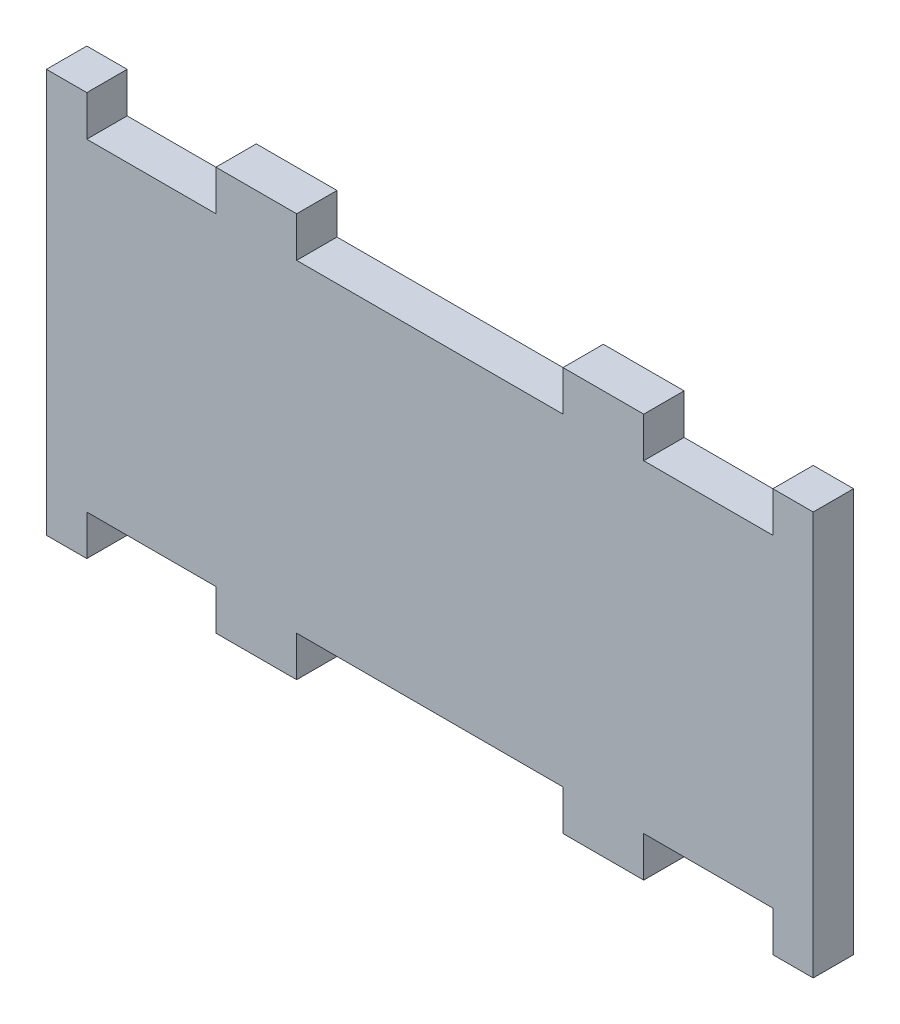
ISO-10303-21;
HEADER;
FILE_DESCRIPTION(('STEP AP214'),'2;1');
FILE_NAME('part.step','',(''),(''),'','','');
FILE_SCHEMA(('AUTOMOTIVE_DESIGN { 1 0 10303 214 1 1 1 1 }'));
ENDSEC;
DATA;
#1=APPLICATION_CONTEXT('core data for automotive mechanical design processes');
#2=APPLICATION_PROTOCOL_DEFINITION('international standard','automotive_design',2000,#1);
#3=PRODUCT_CONTEXT('',#1,'mechanical');
#4=PRODUCT('Part','Part','',(#3));
#5=PRODUCT_RELATED_PRODUCT_CATEGORY('part','',(#4));
#6=PRODUCT_DEFINITION_FORMATION('','',#4);
#7=PRODUCT_DEFINITION_CONTEXT('part definition',#1,'design');
#8=PRODUCT_DEFINITION('design','',#6,#7);
#9=PRODUCT_DEFINITION_SHAPE('','',#8);
#10=(LENGTH_UNIT() NAMED_UNIT(*) SI_UNIT(.MILLI.,.METRE.));
#11=(NAMED_UNIT(*) PLANE_ANGLE_UNIT() SI_UNIT($,.RADIAN.));
#12=(NAMED_UNIT(*) SI_UNIT($,.STERADIAN.) SOLID_ANGLE_UNIT());
#13=UNCERTAINTY_MEASURE_WITH_UNIT(LENGTH_MEASURE(1.E-05),#10,'distance_accuracy_value','');
#14=(GEOMETRIC_REPRESENTATION_CONTEXT(3) GLOBAL_UNCERTAINTY_ASSIGNED_CONTEXT((#13)) GLOBAL_UNIT_ASSIGNED_CONTEXT((#10,
#11,#12)) REPRESENTATION_CONTEXT('',''));
#15=CARTESIAN_POINT('',(0.,0.,0.));
#16=DIRECTION('',(0.,0.,1.));
#17=DIRECTION('',(1.,0.,0.));
#18=AXIS2_PLACEMENT_3D('',#15,#16,#17);
#19=CARTESIAN_POINT('',(0.,0.,6.35));
#20=DIRECTION('',(0.,1.,0.));
#21=DIRECTION('',(0.,0.,1.));
#22=AXIS2_PLACEMENT_3D('',#19,#20,#21);
#23=PLANE('',#22);
#24=DIRECTION('',(1.,0.,0.));
#25=VECTOR('',#24,1.);
#26=CARTESIAN_POINT('',(0.,0.,0.));
#27=LINE('',#26,#25);
#28=CARTESIAN_POINT('',(0.,0.,0.));
#29=VERTEX_POINT('',#28);
#30=CARTESIAN_POINT('',(6.34999999999999,0.,0.));
#31=VERTEX_POINT('',#30);
#32=EDGE_CURVE('E283',#29,#31,#27,.T.);
#33=ORIENTED_EDGE('',*,*,#32,.T.);
#34=DIRECTION('',(0.,0.,1.));
#35=VECTOR('',#34,1.);
#36=CARTESIAN_POINT('',(6.35,0.,-0.00100000000000013));
#37=LINE('',#36,#35);
#38=CARTESIAN_POINT('',(6.35,0.,6.35));
#39=VERTEX_POINT('',#38);
#40=EDGE_CURVE('E313',#31,#39,#37,.T.);
#41=ORIENTED_EDGE('',*,*,#40,.T.);
#42=DIRECTION('',(1.,0.,0.));
#43=VECTOR('',#42,1.);
#44=CARTESIAN_POINT('',(0.,0.,6.35));
#45=LINE('',#44,#43);
#46=CARTESIAN_POINT('',(0.,0.,6.35));
#47=VERTEX_POINT('',#46);
#48=EDGE_CURVE('E267',#47,#39,#45,.T.);
#49=ORIENTED_EDGE('',*,*,#48,.F.);
#50=DIRECTION('',(0.,0.,-1.));
#51=VECTOR('',#50,1.);
#52=CARTESIAN_POINT('',(0.,0.,6.35));
#53=LINE('',#52,#51);
#54=EDGE_CURVE('E11',#47,#29,#53,.T.);
#55=ORIENTED_EDGE('',*,*,#54,.T.);
#56=EDGE_LOOP('',(#33,#41,#49,#55));
#57=FACE_BOUND('',#56,.T.);
#58=ADVANCED_FACE('F39',(#57),#23,.F.);
#59=CARTESIAN_POINT('',(26.67,0.,6.35));
#60=VERTEX_POINT('',#59);
#61=CARTESIAN_POINT('',(39.37,0.,6.35));
#62=VERTEX_POINT('',#61);
#63=EDGE_CURVE('E269',#60,#62,#45,.T.);
#64=ORIENTED_EDGE('',*,*,#63,.F.);
#65=DIRECTION('',(0.,0.,1.));
#66=VECTOR('',#65,1.);
#67=CARTESIAN_POINT('',(26.67,0.,-0.00100000000000013));
#68=LINE('',#67,#66);
#69=CARTESIAN_POINT('',(26.67,0.,0.));
#70=VERTEX_POINT('',#69);
#71=EDGE_CURVE('E427',#70,#60,#68,.T.);
#72=ORIENTED_EDGE('',*,*,#71,.F.);
#73=CARTESIAN_POINT('',(39.37,0.,0.));
#74=VERTEX_POINT('',#73);
#75=EDGE_CURVE('E285',#70,#74,#27,.T.);
#76=ORIENTED_EDGE('',*,*,#75,.T.);
#77=DIRECTION('',(0.,0.,1.));
#78=VECTOR('',#77,1.);
#79=CARTESIAN_POINT('',(39.37,0.,-0.00100000000000013));
#80=LINE('',#79,#78);
#81=EDGE_CURVE('E429',#74,#62,#80,.T.);
#82=ORIENTED_EDGE('',*,*,#81,.T.);
#83=EDGE_LOOP('',(#64,#72,#76,#82));
#84=FACE_BOUND('',#83,.T.);
#85=ADVANCED_FACE('F383',(#84),#23,.F.);
#86=CARTESIAN_POINT('',(81.28,0.,6.35));
#87=VERTEX_POINT('',#86);
#88=CARTESIAN_POINT('',(93.98,0.,6.35));
#89=VERTEX_POINT('',#88);
#90=EDGE_CURVE('E409',#87,#89,#45,.T.);
#91=ORIENTED_EDGE('',*,*,#90,.F.);
#92=DIRECTION('',(0.,0.,1.));
#93=VECTOR('',#92,1.);
#94=CARTESIAN_POINT('',(81.28,0.,-0.00100000000000013));
#95=LINE('',#94,#93);
#96=CARTESIAN_POINT('',(81.28,0.,0.));
#97=VERTEX_POINT('',#96);
#98=EDGE_CURVE('E411',#97,#87,#95,.T.);
#99=ORIENTED_EDGE('',*,*,#98,.F.);
#100=CARTESIAN_POINT('',(93.9799999999999,0.,0.));
#101=VERTEX_POINT('',#100);
#102=EDGE_CURVE('E810',#97,#101,#27,.T.);
#103=ORIENTED_EDGE('',*,*,#102,.T.);
#104=DIRECTION('',(0.,0.,1.));
#105=VECTOR('',#104,1.);
#106=CARTESIAN_POINT('',(93.98,0.,-0.00100000000000013));
#107=LINE('',#106,#105);
#108=EDGE_CURVE('E413',#101,#89,#107,.T.);
#109=ORIENTED_EDGE('',*,*,#108,.T.);
#110=EDGE_LOOP('',(#91,#99,#103,#109));
#111=FACE_BOUND('',#110,.T.);
#112=ADVANCED_FACE('F389',(#111),#23,.F.);
#113=CARTESIAN_POINT('',(0.,63.5,6.35));
#114=DIRECTION('',(0.,1.,0.));
#115=DIRECTION('',(0.,0.,1.));
#116=AXIS2_PLACEMENT_3D('',#113,#114,#115);
#117=PLANE('',#116);
#118=DIRECTION('',(0.,0.,1.));
#119=VECTOR('',#118,1.);
#120=CARTESIAN_POINT('',(114.3,63.5,-0.00100000000000013));
#121=LINE('',#120,#119);
#122=CARTESIAN_POINT('',(114.3,63.5,0.));
#123=VERTEX_POINT('',#122);
#124=CARTESIAN_POINT('',(114.3,63.5,6.35));
#125=VERTEX_POINT('',#124);
#126=EDGE_CURVE('E319',#123,#125,#121,.T.);
#127=ORIENTED_EDGE('',*,*,#126,.T.);
#128=DIRECTION('',(1.,0.,0.));
#129=VECTOR('',#128,1.);
#130=CARTESIAN_POINT('',(0.,63.5,6.35));
#131=LINE('',#130,#129);
#132=CARTESIAN_POINT('',(120.65,63.5,6.35));
#133=VERTEX_POINT('',#132);
#134=EDGE_CURVE('E258',#125,#133,#131,.T.);
#135=ORIENTED_EDGE('',*,*,#134,.T.);
#136=DIRECTION('',(0.,0.,-1.));
#137=VECTOR('',#136,1.);
#138=CARTESIAN_POINT('',(120.65,63.5,6.35));
#139=LINE('',#138,#137);
#140=CARTESIAN_POINT('',(120.65,63.5,0.));
#141=VERTEX_POINT('',#140);
#142=EDGE_CURVE('E288',#133,#141,#139,.T.);
#143=ORIENTED_EDGE('',*,*,#142,.T.);
#144=DIRECTION('',(1.,0.,0.));
#145=VECTOR('',#144,1.);
#146=CARTESIAN_POINT('',(0.,63.5,0.));
#147=LINE('',#146,#145);
#148=EDGE_CURVE('E273',#123,#141,#147,.T.);
#149=ORIENTED_EDGE('',*,*,#148,.F.);
#150=EDGE_LOOP('',(#127,#135,#143,#149));
#151=FACE_BOUND('',#150,.T.);
#152=ADVANCED_FACE('F318',(#151),#117,.T.);
#153=DIRECTION('',(0.,0.,1.));
#154=VECTOR('',#153,1.);
#155=CARTESIAN_POINT('',(39.37,63.5,-0.00100000000000013));
#156=LINE('',#155,#154);
#157=CARTESIAN_POINT('',(39.37,63.5,0.));
#158=VERTEX_POINT('',#157);
#159=CARTESIAN_POINT('',(39.37,63.5,6.35));
#160=VERTEX_POINT('',#159);
#161=EDGE_CURVE('E225',#158,#160,#156,.T.);
#162=ORIENTED_EDGE('',*,*,#161,.F.);
#163=CARTESIAN_POINT('',(26.67,63.5,0.));
#164=VERTEX_POINT('',#163);
#165=EDGE_CURVE('E279',#164,#158,#147,.T.);
#166=ORIENTED_EDGE('',*,*,#165,.F.);
#167=DIRECTION('',(0.,0.,1.));
#168=VECTOR('',#167,1.);
#169=CARTESIAN_POINT('',(26.67,63.5,-0.00100000000000013));
#170=LINE('',#169,#168);
#171=CARTESIAN_POINT('',(26.67,63.5,6.35));
#172=VERTEX_POINT('',#171);
#173=EDGE_CURVE('E252',#164,#172,#170,.T.);
#174=ORIENTED_EDGE('',*,*,#173,.T.);
#175=EDGE_CURVE('E245',#172,#160,#131,.T.);
#176=ORIENTED_EDGE('',*,*,#175,.T.);
#177=EDGE_LOOP('',(#162,#166,#174,#176));
#178=FACE_BOUND('',#177,.T.);
#179=ADVANCED_FACE('F251',(#178),#117,.T.);
#180=DIRECTION('',(0.,0.,1.));
#181=VECTOR('',#180,1.);
#182=CARTESIAN_POINT('',(6.35,63.5,-0.00100000000000013));
#183=LINE('',#182,#181);
#184=CARTESIAN_POINT('',(6.35,63.5,0.));
#185=VERTEX_POINT('',#184);
#186=CARTESIAN_POINT('',(6.35,63.5,6.35));
#187=VERTEX_POINT('',#186);
#188=EDGE_CURVE('E302',#185,#187,#183,.T.);
#189=ORIENTED_EDGE('',*,*,#188,.F.);
#190=CARTESIAN_POINT('',(0.,63.5,0.));
#191=VERTEX_POINT('',#190);
#192=EDGE_CURVE('E275',#191,#185,#147,.T.);
#193=ORIENTED_EDGE('',*,*,#192,.F.);
#194=DIRECTION('',(0.,0.,-1.));
#195=VECTOR('',#194,1.);
#196=CARTESIAN_POINT('',(0.,63.5,6.35));
#197=LINE('',#196,#195);
#198=CARTESIAN_POINT('',(0.,63.5,6.35));
#199=VERTEX_POINT('',#198);
#200=EDGE_CURVE('E43',#199,#191,#197,.T.);
#201=ORIENTED_EDGE('',*,*,#200,.F.);
#202=EDGE_CURVE('E253',#199,#187,#131,.T.);
#203=ORIENTED_EDGE('',*,*,#202,.T.);
#204=EDGE_LOOP('',(#189,#193,#201,#203));
#205=FACE_BOUND('',#204,.T.);
#206=ADVANCED_FACE('F301',(#205),#117,.T.);
#207=CARTESIAN_POINT('',(0.,0.,6.35));
#208=DIRECTION('',(-1.,0.,0.));
#209=DIRECTION('',(0.,0.,1.));
#210=AXIS2_PLACEMENT_3D('',#207,#208,#209);
#211=PLANE('',#210);
#212=DIRECTION('',(0.,1.,0.));
#213=VECTOR('',#212,1.);
#214=CARTESIAN_POINT('',(0.,0.,0.));
#215=LINE('',#214,#213);
#216=EDGE_CURVE('E270',#29,#191,#215,.T.);
#217=ORIENTED_EDGE('',*,*,#216,.F.);
#218=ORIENTED_EDGE('',*,*,#54,.F.);
#219=DIRECTION('',(0.,1.,0.));
#220=VECTOR('',#219,1.);
#221=CARTESIAN_POINT('',(0.,0.,6.35));
#222=LINE('',#221,#220);
#223=EDGE_CURVE('E262',#47,#199,#222,.T.);
#224=ORIENTED_EDGE('',*,*,#223,.T.);
#225=ORIENTED_EDGE('',*,*,#200,.T.);
#226=EDGE_LOOP('',(#217,#218,#224,#225));
#227=FACE_BOUND('',#226,.T.);
#228=ADVANCED_FACE('F41',(#227),#211,.T.);
#229=CARTESIAN_POINT('',(114.3,0.,6.35));
#230=VERTEX_POINT('',#229);
#231=CARTESIAN_POINT('',(120.65,0.,6.35));
#232=VERTEX_POINT('',#231);
#233=EDGE_CURVE('E266',#230,#232,#45,.T.);
#234=ORIENTED_EDGE('',*,*,#233,.F.);
#235=DIRECTION('',(0.,0.,1.));
#236=VECTOR('',#235,1.);
#237=CARTESIAN_POINT('',(114.3,0.,-0.00100000000000013));
#238=LINE('',#237,#236);
#239=CARTESIAN_POINT('',(114.3,0.,0.));
#240=VERTEX_POINT('',#239);
#241=EDGE_CURVE('E789',#240,#230,#238,.T.);
#242=ORIENTED_EDGE('',*,*,#241,.F.);
#243=CARTESIAN_POINT('',(120.65,0.,0.));
#244=VERTEX_POINT('',#243);
#245=EDGE_CURVE('E282',#240,#244,#27,.T.);
#246=ORIENTED_EDGE('',*,*,#245,.T.);
#247=DIRECTION('',(0.,0.,-1.));
#248=VECTOR('',#247,1.);
#249=CARTESIAN_POINT('',(120.65,0.,6.35));
#250=LINE('',#249,#248);
#251=EDGE_CURVE('E48',#232,#244,#250,.T.);
#252=ORIENTED_EDGE('',*,*,#251,.F.);
#253=EDGE_LOOP('',(#234,#242,#246,#252));
#254=FACE_BOUND('',#253,.T.);
#255=ADVANCED_FACE('F385',(#254),#23,.F.);
#256=CARTESIAN_POINT('',(120.65,0.,6.35));
#257=DIRECTION('',(-1.,0.,0.));
#258=DIRECTION('',(0.,0.,1.));
#259=AXIS2_PLACEMENT_3D('',#256,#257,#258);
#260=PLANE('',#259);
#261=DIRECTION('',(0.,1.,0.));
#262=VECTOR('',#261,1.);
#263=CARTESIAN_POINT('',(120.65,0.,0.));
#264=LINE('',#263,#262);
#265=EDGE_CURVE('E278',#244,#141,#264,.T.);
#266=ORIENTED_EDGE('',*,*,#265,.T.);
#267=ORIENTED_EDGE('',*,*,#142,.F.);
#268=DIRECTION('',(0.,1.,0.));
#269=VECTOR('',#268,1.);
#270=CARTESIAN_POINT('',(120.65,0.,6.35));
#271=LINE('',#270,#269);
#272=EDGE_CURVE('E257',#232,#133,#271,.T.);
#273=ORIENTED_EDGE('',*,*,#272,.F.);
#274=ORIENTED_EDGE('',*,*,#251,.T.);
#275=EDGE_LOOP('',(#266,#267,#273,#274));
#276=FACE_BOUND('',#275,.T.);
#277=ADVANCED_FACE('F326',(#276),#260,.F.);
#278=DIRECTION('',(0.,0.,1.));
#279=VECTOR('',#278,1.);
#280=CARTESIAN_POINT('',(93.98,63.5,-0.00100000000000013));
#281=LINE('',#280,#279);
#282=CARTESIAN_POINT('',(93.98,63.5,0.));
#283=VERTEX_POINT('',#282);
#284=CARTESIAN_POINT('',(93.98,63.5,6.35));
#285=VERTEX_POINT('',#284);
#286=EDGE_CURVE('E764',#283,#285,#281,.T.);
#287=ORIENTED_EDGE('',*,*,#286,.F.);
#288=CARTESIAN_POINT('',(81.2799999999999,63.5,0.));
#289=VERTEX_POINT('',#288);
#290=EDGE_CURVE('E333',#289,#283,#147,.T.);
#291=ORIENTED_EDGE('',*,*,#290,.F.);
#292=DIRECTION('',(0.,0.,1.));
#293=VECTOR('',#292,1.);
#294=CARTESIAN_POINT('',(81.28,63.5,-0.00100000000000013));
#295=LINE('',#294,#293);
#296=CARTESIAN_POINT('',(81.28,63.5,6.35));
#297=VERTEX_POINT('',#296);
#298=EDGE_CURVE('E237',#289,#297,#295,.T.);
#299=ORIENTED_EDGE('',*,*,#298,.T.);
#300=EDGE_CURVE('E254',#297,#285,#131,.T.);
#301=ORIENTED_EDGE('',*,*,#300,.T.);
#302=EDGE_LOOP('',(#287,#291,#299,#301));
#303=FACE_BOUND('',#302,.T.);
#304=ADVANCED_FACE('F399',(#303),#117,.T.);
#305=CARTESIAN_POINT('',(0.,0.,6.35));
#306=DIRECTION('',(0.,0.,-1.));
#307=DIRECTION('',(-1.,0.,0.));
#308=AXIS2_PLACEMENT_3D('',#305,#306,#307);
#309=PLANE('',#308);
#310=ORIENTED_EDGE('',*,*,#48,.T.);
#311=DIRECTION('',(0.,-1.,0.));
#312=VECTOR('',#311,1.);
#313=CARTESIAN_POINT('',(6.35,0.,6.35));
#314=LINE('',#313,#312);
#315=CARTESIAN_POINT('',(6.35,6.35,6.35));
#316=VERTEX_POINT('',#315);
#317=EDGE_CURVE('E465',#316,#39,#314,.T.);
#318=ORIENTED_EDGE('',*,*,#317,.F.);
#319=DIRECTION('',(-1.,0.,0.));
#320=VECTOR('',#319,1.);
#321=CARTESIAN_POINT('',(6.35,6.35,6.35));
#322=LINE('',#321,#320);
#323=CARTESIAN_POINT('',(26.67,6.34999999999998,6.35));
#324=VERTEX_POINT('',#323);
#325=EDGE_CURVE('E457',#324,#316,#322,.T.);
#326=ORIENTED_EDGE('',*,*,#325,.F.);
#327=DIRECTION('',(0.,1.,0.));
#328=VECTOR('',#327,1.);
#329=CARTESIAN_POINT('',(26.67,0.,6.35));
#330=LINE('',#329,#328);
#331=EDGE_CURVE('E423',#60,#324,#330,.T.);
#332=ORIENTED_EDGE('',*,*,#331,.F.);
#333=ORIENTED_EDGE('',*,*,#63,.T.);
#334=DIRECTION('',(0.,-1.,0.));
#335=VECTOR('',#334,1.);
#336=CARTESIAN_POINT('',(39.37,0.,6.35));
#337=LINE('',#336,#335);
#338=CARTESIAN_POINT('',(39.37,6.34999999999999,6.35));
#339=VERTEX_POINT('',#338);
#340=EDGE_CURVE('E421',#339,#62,#337,.T.);
#341=ORIENTED_EDGE('',*,*,#340,.F.);
#342=DIRECTION('',(-1.,0.,0.));
#343=VECTOR('',#342,1.);
#344=CARTESIAN_POINT('',(39.37,6.34999999999999,6.35));
#345=LINE('',#344,#343);
#346=CARTESIAN_POINT('',(81.28,6.34999999999999,6.35));
#347=VERTEX_POINT('',#346);
#348=EDGE_CURVE('E432',#347,#339,#345,.T.);
#349=ORIENTED_EDGE('',*,*,#348,.F.);
#350=DIRECTION('',(0.,1.,0.));
#351=VECTOR('',#350,1.);
#352=CARTESIAN_POINT('',(81.28,0.,6.35));
#353=LINE('',#352,#351);
#354=EDGE_CURVE('E435',#87,#347,#353,.T.);
#355=ORIENTED_EDGE('',*,*,#354,.F.);
#356=ORIENTED_EDGE('',*,*,#90,.T.);
#357=DIRECTION('',(0.,-1.,0.));
#358=VECTOR('',#357,1.);
#359=CARTESIAN_POINT('',(93.98,0.,6.35));
#360=LINE('',#359,#358);
#361=CARTESIAN_POINT('',(93.98,6.34999999999999,6.35));
#362=VERTEX_POINT('',#361);
#363=EDGE_CURVE('E791',#362,#89,#360,.T.);
#364=ORIENTED_EDGE('',*,*,#363,.F.);
#365=DIRECTION('',(-1.,0.,0.));
#366=VECTOR('',#365,1.);
#367=CARTESIAN_POINT('',(114.3,6.34999999999999,6.35));
#368=LINE('',#367,#366);
#369=CARTESIAN_POINT('',(114.3,6.34999999999999,6.35));
#370=VERTEX_POINT('',#369);
#371=EDGE_CURVE('E798',#370,#362,#368,.T.);
#372=ORIENTED_EDGE('',*,*,#371,.F.);
#373=DIRECTION('',(0.,1.,0.));
#374=VECTOR('',#373,1.);
#375=CARTESIAN_POINT('',(114.3,0.,6.35));
#376=LINE('',#375,#374);
#377=EDGE_CURVE('E801',#230,#370,#376,.T.);
#378=ORIENTED_EDGE('',*,*,#377,.F.);
#379=ORIENTED_EDGE('',*,*,#233,.T.);
#380=ORIENTED_EDGE('',*,*,#272,.T.);
#381=ORIENTED_EDGE('',*,*,#134,.F.);
#382=DIRECTION('',(0.,1.,0.));
#383=VECTOR('',#382,1.);
#384=CARTESIAN_POINT('',(114.3,63.5,6.35));
#385=LINE('',#384,#383);
#386=CARTESIAN_POINT('',(114.3,57.15,6.35));
#387=VERTEX_POINT('',#386);
#388=EDGE_CURVE('E781',#387,#125,#385,.T.);
#389=ORIENTED_EDGE('',*,*,#388,.F.);
#390=DIRECTION('',(1.,0.,0.));
#391=VECTOR('',#390,1.);
#392=CARTESIAN_POINT('',(114.3,57.15,6.35));
#393=LINE('',#392,#391);
#394=CARTESIAN_POINT('',(93.98,57.15,6.35));
#395=VERTEX_POINT('',#394);
#396=EDGE_CURVE('E771',#395,#387,#393,.T.);
#397=ORIENTED_EDGE('',*,*,#396,.F.);
#398=DIRECTION('',(0.,-1.,0.));
#399=VECTOR('',#398,1.);
#400=CARTESIAN_POINT('',(93.98,63.5,6.35));
#401=LINE('',#400,#399);
#402=EDGE_CURVE('E779',#285,#395,#401,.T.);
#403=ORIENTED_EDGE('',*,*,#402,.F.);
#404=ORIENTED_EDGE('',*,*,#300,.F.);
#405=DIRECTION('',(0.,1.,0.));
#406=VECTOR('',#405,1.);
#407=CARTESIAN_POINT('',(81.28,63.5,6.35));
#408=LINE('',#407,#406);
#409=CARTESIAN_POINT('',(81.28,57.15,6.35));
#410=VERTEX_POINT('',#409);
#411=EDGE_CURVE('E816',#410,#297,#408,.T.);
#412=ORIENTED_EDGE('',*,*,#411,.F.);
#413=DIRECTION('',(1.,0.,0.));
#414=VECTOR('',#413,1.);
#415=CARTESIAN_POINT('',(39.37,57.15,6.35));
#416=LINE('',#415,#414);
#417=CARTESIAN_POINT('',(39.37,57.15,6.35));
#418=VERTEX_POINT('',#417);
#419=EDGE_CURVE('E248',#418,#410,#416,.T.);
#420=ORIENTED_EDGE('',*,*,#419,.F.);
#421=DIRECTION('',(0.,-1.,0.));
#422=VECTOR('',#421,1.);
#423=CARTESIAN_POINT('',(39.37,63.5,6.35));
#424=LINE('',#423,#422);
#425=EDGE_CURVE('E229',#160,#418,#424,.T.);
#426=ORIENTED_EDGE('',*,*,#425,.F.);
#427=ORIENTED_EDGE('',*,*,#175,.F.);
#428=DIRECTION('',(0.,1.,0.));
#429=VECTOR('',#428,1.);
#430=CARTESIAN_POINT('',(26.67,63.5,6.35));
#431=LINE('',#430,#429);
#432=CARTESIAN_POINT('',(26.67,57.15,6.35));
#433=VERTEX_POINT('',#432);
#434=EDGE_CURVE('E359',#433,#172,#431,.T.);
#435=ORIENTED_EDGE('',*,*,#434,.F.);
#436=DIRECTION('',(1.,0.,0.));
#437=VECTOR('',#436,1.);
#438=CARTESIAN_POINT('',(6.35000000000001,57.15,6.35));
#439=LINE('',#438,#437);
#440=CARTESIAN_POINT('',(6.35000000000001,57.15,6.35));
#441=VERTEX_POINT('',#440);
#442=EDGE_CURVE('E356',#441,#433,#439,.T.);
#443=ORIENTED_EDGE('',*,*,#442,.F.);
#444=DIRECTION('',(0.,-1.,0.));
#445=VECTOR('',#444,1.);
#446=CARTESIAN_POINT('',(6.35,63.5,6.35));
#447=LINE('',#446,#445);
#448=EDGE_CURVE('E347',#187,#441,#447,.T.);
#449=ORIENTED_EDGE('',*,*,#448,.F.);
#450=ORIENTED_EDGE('',*,*,#202,.F.);
#451=ORIENTED_EDGE('',*,*,#223,.F.);
#452=EDGE_LOOP('',(#310,#318,#326,#332,#333,#341,#349,#355,#356,#364,#372,#378,#379,#380,#381,
#389,#397,#403,#404,#412,#420,#426,#427,#435,#443,#449,#450,#451));
#453=FACE_BOUND('',#452,.T.);
#454=ADVANCED_FACE('F243',(#453),#309,.F.);
#455=CARTESIAN_POINT('',(0.,0.,0.));
#456=DIRECTION('',(0.,0.,-1.));
#457=DIRECTION('',(-1.,0.,0.));
#458=AXIS2_PLACEMENT_3D('',#455,#456,#457);
#459=PLANE('',#458);
#460=DIRECTION('',(0.,-1.,0.));
#461=VECTOR('',#460,1.);
#462=CARTESIAN_POINT('',(6.35,0.,0.));
#463=LINE('',#462,#461);
#464=CARTESIAN_POINT('',(6.35,6.35,0.));
#465=VERTEX_POINT('',#464);
#466=EDGE_CURVE('E309',#465,#31,#463,.T.);
#467=ORIENTED_EDGE('',*,*,#466,.T.);
#468=ORIENTED_EDGE('',*,*,#32,.F.);
#469=ORIENTED_EDGE('',*,*,#216,.T.);
#470=ORIENTED_EDGE('',*,*,#192,.T.);
#471=DIRECTION('',(0.,-1.,0.));
#472=VECTOR('',#471,1.);
#473=CARTESIAN_POINT('',(6.35,63.5,0.));
#474=LINE('',#473,#472);
#475=CARTESIAN_POINT('',(6.35000000000001,57.15,0.));
#476=VERTEX_POINT('',#475);
#477=EDGE_CURVE('E344',#185,#476,#474,.T.);
#478=ORIENTED_EDGE('',*,*,#477,.T.);
#479=DIRECTION('',(1.,0.,0.));
#480=VECTOR('',#479,1.);
#481=CARTESIAN_POINT('',(6.35000000000001,57.15,0.));
#482=LINE('',#481,#480);
#483=CARTESIAN_POINT('',(26.67,57.15,0.));
#484=VERTEX_POINT('',#483);
#485=EDGE_CURVE('E274',#476,#484,#482,.T.);
#486=ORIENTED_EDGE('',*,*,#485,.T.);
#487=DIRECTION('',(0.,1.,0.));
#488=VECTOR('',#487,1.);
#489=CARTESIAN_POINT('',(26.67,63.5,0.));
#490=LINE('',#489,#488);
#491=EDGE_CURVE('E342',#484,#164,#490,.T.);
#492=ORIENTED_EDGE('',*,*,#491,.T.);
#493=ORIENTED_EDGE('',*,*,#165,.T.);
#494=DIRECTION('',(0.,-1.,0.));
#495=VECTOR('',#494,1.);
#496=CARTESIAN_POINT('',(39.37,63.5,0.));
#497=LINE('',#496,#495);
#498=CARTESIAN_POINT('',(39.37,57.15,0.));
#499=VERTEX_POINT('',#498);
#500=EDGE_CURVE('E232',#158,#499,#497,.T.);
#501=ORIENTED_EDGE('',*,*,#500,.T.);
#502=DIRECTION('',(1.,0.,0.));
#503=VECTOR('',#502,1.);
#504=CARTESIAN_POINT('',(39.37,57.15,0.));
#505=LINE('',#504,#503);
#506=CARTESIAN_POINT('',(81.28,57.15,0.));
#507=VERTEX_POINT('',#506);
#508=EDGE_CURVE('E238',#499,#507,#505,.T.);
#509=ORIENTED_EDGE('',*,*,#508,.T.);
#510=DIRECTION('',(0.,1.,0.));
#511=VECTOR('',#510,1.);
#512=CARTESIAN_POINT('',(81.28,63.5,0.));
#513=LINE('',#512,#511);
#514=EDGE_CURVE('E345',#507,#289,#513,.T.);
#515=ORIENTED_EDGE('',*,*,#514,.T.);
#516=ORIENTED_EDGE('',*,*,#290,.T.);
#517=DIRECTION('',(0.,-1.,0.));
#518=VECTOR('',#517,1.);
#519=CARTESIAN_POINT('',(93.98,63.5,0.));
#520=LINE('',#519,#518);
#521=CARTESIAN_POINT('',(93.98,57.15,0.));
#522=VERTEX_POINT('',#521);
#523=EDGE_CURVE('E786',#283,#522,#520,.T.);
#524=ORIENTED_EDGE('',*,*,#523,.T.);
#525=DIRECTION('',(1.,0.,0.));
#526=VECTOR('',#525,1.);
#527=CARTESIAN_POINT('',(114.3,57.15,0.));
#528=LINE('',#527,#526);
#529=CARTESIAN_POINT('',(114.3,57.15,0.));
#530=VERTEX_POINT('',#529);
#531=EDGE_CURVE('E784',#522,#530,#528,.T.);
#532=ORIENTED_EDGE('',*,*,#531,.T.);
#533=DIRECTION('',(0.,1.,0.));
#534=VECTOR('',#533,1.);
#535=CARTESIAN_POINT('',(114.3,63.5,0.));
#536=LINE('',#535,#534);
#537=EDGE_CURVE('E332',#530,#123,#536,.T.);
#538=ORIENTED_EDGE('',*,*,#537,.T.);
#539=ORIENTED_EDGE('',*,*,#148,.T.);
#540=ORIENTED_EDGE('',*,*,#265,.F.);
#541=ORIENTED_EDGE('',*,*,#245,.F.);
#542=DIRECTION('',(0.,1.,0.));
#543=VECTOR('',#542,1.);
#544=CARTESIAN_POINT('',(114.3,0.,0.));
#545=LINE('',#544,#543);
#546=CARTESIAN_POINT('',(114.3,6.34999999999999,0.));
#547=VERTEX_POINT('',#546);
#548=EDGE_CURVE('E455',#240,#547,#545,.T.);
#549=ORIENTED_EDGE('',*,*,#548,.T.);
#550=DIRECTION('',(-1.,0.,0.));
#551=VECTOR('',#550,1.);
#552=CARTESIAN_POINT('',(114.3,6.34999999999999,0.));
#553=LINE('',#552,#551);
#554=CARTESIAN_POINT('',(93.98,6.34999999999999,0.));
#555=VERTEX_POINT('',#554);
#556=EDGE_CURVE('E439',#547,#555,#553,.T.);
#557=ORIENTED_EDGE('',*,*,#556,.T.);
#558=DIRECTION('',(0.,-1.,0.));
#559=VECTOR('',#558,1.);
#560=CARTESIAN_POINT('',(93.98,0.,0.));
#561=LINE('',#560,#559);
#562=EDGE_CURVE('E803',#555,#101,#561,.T.);
#563=ORIENTED_EDGE('',*,*,#562,.T.);
#564=ORIENTED_EDGE('',*,*,#102,.F.);
#565=DIRECTION('',(0.,1.,0.));
#566=VECTOR('',#565,1.);
#567=CARTESIAN_POINT('',(81.28,0.,0.));
#568=LINE('',#567,#566);
#569=CARTESIAN_POINT('',(81.28,6.34999999999999,0.));
#570=VERTEX_POINT('',#569);
#571=EDGE_CURVE('E452',#97,#570,#568,.T.);
#572=ORIENTED_EDGE('',*,*,#571,.T.);
#573=DIRECTION('',(-1.,0.,0.));
#574=VECTOR('',#573,1.);
#575=CARTESIAN_POINT('',(39.37,6.34999999999999,0.));
#576=LINE('',#575,#574);
#577=CARTESIAN_POINT('',(39.37,6.34999999999999,0.));
#578=VERTEX_POINT('',#577);
#579=EDGE_CURVE('E449',#570,#578,#576,.T.);
#580=ORIENTED_EDGE('',*,*,#579,.T.);
#581=DIRECTION('',(0.,-1.,0.));
#582=VECTOR('',#581,1.);
#583=CARTESIAN_POINT('',(39.37,0.,0.));
#584=LINE('',#583,#582);
#585=EDGE_CURVE('E447',#578,#74,#584,.T.);
#586=ORIENTED_EDGE('',*,*,#585,.T.);
#587=ORIENTED_EDGE('',*,*,#75,.F.);
#588=DIRECTION('',(0.,1.,0.));
#589=VECTOR('',#588,1.);
#590=CARTESIAN_POINT('',(26.67,0.,0.));
#591=LINE('',#590,#589);
#592=CARTESIAN_POINT('',(26.67,6.34999999999998,0.));
#593=VERTEX_POINT('',#592);
#594=EDGE_CURVE('E351',#70,#593,#591,.T.);
#595=ORIENTED_EDGE('',*,*,#594,.T.);
#596=DIRECTION('',(-1.,0.,0.));
#597=VECTOR('',#596,1.);
#598=CARTESIAN_POINT('',(6.35,6.35,0.));
#599=LINE('',#598,#597);
#600=EDGE_CURVE('E467',#593,#465,#599,.T.);
#601=ORIENTED_EDGE('',*,*,#600,.T.);
#602=EDGE_LOOP('',(#467,#468,#469,#470,#478,#486,#492,#493,#501,#509,#515,#516,#524,#532,#538,
#539,#540,#541,#549,#557,#563,#564,#572,#580,#586,#587,#595,#601));
#603=FACE_BOUND('',#602,.T.);
#604=ADVANCED_FACE('F307',(#603),#459,.T.);
#605=CARTESIAN_POINT('',(6.35,63.5,-0.00100000000000013));
#606=DIRECTION('',(-1.,0.,0.));
#607=DIRECTION('',(0.,-1.,0.));
#608=AXIS2_PLACEMENT_3D('',#605,#606,#607);
#609=PLANE('',#608);
#610=ORIENTED_EDGE('',*,*,#188,.T.);
#611=ORIENTED_EDGE('',*,*,#448,.T.);
#612=DIRECTION('',(0.,0.,1.));
#613=VECTOR('',#612,1.);
#614=CARTESIAN_POINT('',(6.35000000000001,57.15,-0.00100000000000013));
#615=LINE('',#614,#613);
#616=EDGE_CURVE('E361',#476,#441,#615,.T.);
#617=ORIENTED_EDGE('',*,*,#616,.F.);
#618=ORIENTED_EDGE('',*,*,#477,.F.);
#619=EDGE_LOOP('',(#610,#611,#617,#618));
#620=FACE_BOUND('',#619,.T.);
#621=ADVANCED_FACE('F371',(#620),#609,.F.);
#622=CARTESIAN_POINT('',(26.67,63.5,-0.00100000000000013));
#623=DIRECTION('',(1.,0.,0.));
#624=DIRECTION('',(0.,0.,-1.));
#625=AXIS2_PLACEMENT_3D('',#622,#623,#624);
#626=PLANE('',#625);
#627=DIRECTION('',(0.,0.,1.));
#628=VECTOR('',#627,1.);
#629=CARTESIAN_POINT('',(26.67,57.15,-0.00100000000000013));
#630=LINE('',#629,#628);
#631=EDGE_CURVE('E364',#484,#433,#630,.T.);
#632=ORIENTED_EDGE('',*,*,#631,.T.);
#633=ORIENTED_EDGE('',*,*,#434,.T.);
#634=ORIENTED_EDGE('',*,*,#173,.F.);
#635=ORIENTED_EDGE('',*,*,#491,.F.);
#636=EDGE_LOOP('',(#632,#633,#634,#635));
#637=FACE_BOUND('',#636,.T.);
#638=ADVANCED_FACE('F372',(#637),#626,.F.);
#639=CARTESIAN_POINT('',(6.35000000000001,57.15,-0.00100000000000013));
#640=DIRECTION('',(0.,-1.,0.));
#641=DIRECTION('',(1.,0.,0.));
#642=AXIS2_PLACEMENT_3D('',#639,#640,#641);
#643=PLANE('',#642);
#644=ORIENTED_EDGE('',*,*,#616,.T.);
#645=ORIENTED_EDGE('',*,*,#442,.T.);
#646=ORIENTED_EDGE('',*,*,#631,.F.);
#647=ORIENTED_EDGE('',*,*,#485,.F.);
#648=EDGE_LOOP('',(#644,#645,#646,#647));
#649=FACE_BOUND('',#648,.T.);
#650=ADVANCED_FACE('F368',(#649),#643,.F.);
#651=CARTESIAN_POINT('',(39.37,63.5,-0.00100000000000013));
#652=DIRECTION('',(-1.,0.,0.));
#653=DIRECTION('',(0.,0.,1.));
#654=AXIS2_PLACEMENT_3D('',#651,#652,#653);
#655=PLANE('',#654);
#656=ORIENTED_EDGE('',*,*,#161,.T.);
#657=ORIENTED_EDGE('',*,*,#425,.T.);
#658=DIRECTION('',(0.,0.,1.));
#659=VECTOR('',#658,1.);
#660=CARTESIAN_POINT('',(39.37,57.15,-0.00100000000000013));
#661=LINE('',#660,#659);
#662=EDGE_CURVE('E814',#499,#418,#661,.T.);
#663=ORIENTED_EDGE('',*,*,#662,.F.);
#664=ORIENTED_EDGE('',*,*,#500,.F.);
#665=EDGE_LOOP('',(#656,#657,#663,#664));
#666=FACE_BOUND('',#665,.T.);
#667=ADVANCED_FACE('F227',(#666),#655,.F.);
#668=CARTESIAN_POINT('',(81.28,63.5,-0.00100000000000013));
#669=DIRECTION('',(1.,0.,0.));
#670=DIRECTION('',(0.,0.,-1.));
#671=AXIS2_PLACEMENT_3D('',#668,#669,#670);
#672=PLANE('',#671);
#673=DIRECTION('',(0.,0.,1.));
#674=VECTOR('',#673,1.);
#675=CARTESIAN_POINT('',(81.28,57.15,-0.00100000000000013));
#676=LINE('',#675,#674);
#677=EDGE_CURVE('E817',#507,#410,#676,.T.);
#678=ORIENTED_EDGE('',*,*,#677,.T.);
#679=ORIENTED_EDGE('',*,*,#411,.T.);
#680=ORIENTED_EDGE('',*,*,#298,.F.);
#681=ORIENTED_EDGE('',*,*,#514,.F.);
#682=EDGE_LOOP('',(#678,#679,#680,#681));
#683=FACE_BOUND('',#682,.T.);
#684=ADVANCED_FACE('F601',(#683),#672,.F.);
#685=CARTESIAN_POINT('',(39.37,57.15,-0.00100000000000013));
#686=DIRECTION('',(0.,-1.,0.));
#687=DIRECTION('',(1.,0.,0.));
#688=AXIS2_PLACEMENT_3D('',#685,#686,#687);
#689=PLANE('',#688);
#690=ORIENTED_EDGE('',*,*,#662,.T.);
#691=ORIENTED_EDGE('',*,*,#419,.T.);
#692=ORIENTED_EDGE('',*,*,#677,.F.);
#693=ORIENTED_EDGE('',*,*,#508,.F.);
#694=EDGE_LOOP('',(#690,#691,#692,#693));
#695=FACE_BOUND('',#694,.T.);
#696=ADVANCED_FACE('F590',(#695),#689,.F.);
#697=CARTESIAN_POINT('',(114.3,63.5,-0.00100000000000013));
#698=DIRECTION('',(1.,0.,0.));
#699=DIRECTION('',(0.,0.,-1.));
#700=AXIS2_PLACEMENT_3D('',#697,#698,#699);
#701=PLANE('',#700);
#702=DIRECTION('',(0.,0.,1.));
#703=VECTOR('',#702,1.);
#704=CARTESIAN_POINT('',(114.3,57.15,-0.00100000000000013));
#705=LINE('',#704,#703);
#706=EDGE_CURVE('E773',#530,#387,#705,.T.);
#707=ORIENTED_EDGE('',*,*,#706,.T.);
#708=ORIENTED_EDGE('',*,*,#388,.T.);
#709=ORIENTED_EDGE('',*,*,#126,.F.);
#710=ORIENTED_EDGE('',*,*,#537,.F.);
#711=EDGE_LOOP('',(#707,#708,#709,#710));
#712=FACE_BOUND('',#711,.T.);
#713=ADVANCED_FACE('F579',(#712),#701,.F.);
#714=CARTESIAN_POINT('',(114.3,57.15,-0.00100000000000013));
#715=DIRECTION('',(0.,-1.,0.));
#716=DIRECTION('',(1.,0.,0.));
#717=AXIS2_PLACEMENT_3D('',#714,#715,#716);
#718=PLANE('',#717);
#719=DIRECTION('',(0.,0.,1.));
#720=VECTOR('',#719,1.);
#721=CARTESIAN_POINT('',(93.98,57.15,-0.00100000000000013));
#722=LINE('',#721,#720);
#723=EDGE_CURVE('E769',#522,#395,#722,.T.);
#724=ORIENTED_EDGE('',*,*,#723,.T.);
#725=ORIENTED_EDGE('',*,*,#396,.T.);
#726=ORIENTED_EDGE('',*,*,#706,.F.);
#727=ORIENTED_EDGE('',*,*,#531,.F.);
#728=EDGE_LOOP('',(#724,#725,#726,#727));
#729=FACE_BOUND('',#728,.T.);
#730=ADVANCED_FACE('F568',(#729),#718,.F.);
#731=CARTESIAN_POINT('',(93.98,63.5,-0.00100000000000013));
#732=DIRECTION('',(-1.,0.,0.));
#733=DIRECTION('',(0.,0.,1.));
#734=AXIS2_PLACEMENT_3D('',#731,#732,#733);
#735=PLANE('',#734);
#736=ORIENTED_EDGE('',*,*,#286,.T.);
#737=ORIENTED_EDGE('',*,*,#402,.T.);
#738=ORIENTED_EDGE('',*,*,#723,.F.);
#739=ORIENTED_EDGE('',*,*,#523,.F.);
#740=EDGE_LOOP('',(#736,#737,#738,#739));
#741=FACE_BOUND('',#740,.T.);
#742=ADVANCED_FACE('F557',(#741),#735,.F.);
#743=CARTESIAN_POINT('',(93.98,0.,-0.00100000000000013));
#744=DIRECTION('',(-1.,0.,0.));
#745=DIRECTION('',(0.,0.,1.));
#746=AXIS2_PLACEMENT_3D('',#743,#744,#745);
#747=PLANE('',#746);
#748=DIRECTION('',(0.,0.,1.));
#749=VECTOR('',#748,1.);
#750=CARTESIAN_POINT('',(93.98,6.34999999999999,-0.00100000000000013));
#751=LINE('',#750,#749);
#752=EDGE_CURVE('E794',#555,#362,#751,.T.);
#753=ORIENTED_EDGE('',*,*,#752,.T.);
#754=ORIENTED_EDGE('',*,*,#363,.T.);
#755=ORIENTED_EDGE('',*,*,#108,.F.);
#756=ORIENTED_EDGE('',*,*,#562,.F.);
#757=EDGE_LOOP('',(#753,#754,#755,#756));
#758=FACE_BOUND('',#757,.T.);
#759=ADVANCED_FACE('F546',(#758),#747,.F.);
#760=CARTESIAN_POINT('',(114.3,6.34999999999999,-0.00100000000000013));
#761=DIRECTION('',(0.,1.,0.));
#762=DIRECTION('',(0.,0.,1.));
#763=AXIS2_PLACEMENT_3D('',#760,#761,#762);
#764=PLANE('',#763);
#765=DIRECTION('',(0.,0.,1.));
#766=VECTOR('',#765,1.);
#767=CARTESIAN_POINT('',(114.3,6.34999999999999,-0.00100000000000013));
#768=LINE('',#767,#766);
#769=EDGE_CURVE('E792',#547,#370,#768,.T.);
#770=ORIENTED_EDGE('',*,*,#769,.T.);
#771=ORIENTED_EDGE('',*,*,#371,.T.);
#772=ORIENTED_EDGE('',*,*,#752,.F.);
#773=ORIENTED_EDGE('',*,*,#556,.F.);
#774=EDGE_LOOP('',(#770,#771,#772,#773));
#775=FACE_BOUND('',#774,.T.);
#776=ADVANCED_FACE('F535',(#775),#764,.F.);
#777=CARTESIAN_POINT('',(114.3,0.,-0.00100000000000013));
#778=DIRECTION('',(1.,0.,0.));
#779=DIRECTION('',(0.,0.,-1.));
#780=AXIS2_PLACEMENT_3D('',#777,#778,#779);
#781=PLANE('',#780);
#782=ORIENTED_EDGE('',*,*,#241,.T.);
#783=ORIENTED_EDGE('',*,*,#377,.T.);
#784=ORIENTED_EDGE('',*,*,#769,.F.);
#785=ORIENTED_EDGE('',*,*,#548,.F.);
#786=EDGE_LOOP('',(#782,#783,#784,#785));
#787=FACE_BOUND('',#786,.T.);
#788=ADVANCED_FACE('F525',(#787),#781,.F.);
#789=CARTESIAN_POINT('',(39.37,0.,-0.00100000000000013));
#790=DIRECTION('',(-1.,0.,0.));
#791=DIRECTION('',(0.,0.,1.));
#792=AXIS2_PLACEMENT_3D('',#789,#790,#791);
#793=PLANE('',#792);
#794=DIRECTION('',(0.,0.,1.));
#795=VECTOR('',#794,1.);
#796=CARTESIAN_POINT('',(39.37,6.34999999999999,-0.00100000000000013));
#797=LINE('',#796,#795);
#798=EDGE_CURVE('E443',#578,#339,#797,.T.);
#799=ORIENTED_EDGE('',*,*,#798,.T.);
#800=ORIENTED_EDGE('',*,*,#340,.T.);
#801=ORIENTED_EDGE('',*,*,#81,.F.);
#802=ORIENTED_EDGE('',*,*,#585,.F.);
#803=EDGE_LOOP('',(#799,#800,#801,#802));
#804=FACE_BOUND('',#803,.T.);
#805=ADVANCED_FACE('F515',(#804),#793,.F.);
#806=CARTESIAN_POINT('',(39.37,6.34999999999999,-0.00100000000000013));
#807=DIRECTION('',(0.,1.,0.));
#808=DIRECTION('',(-1.,0.,0.));
#809=AXIS2_PLACEMENT_3D('',#806,#807,#808);
#810=PLANE('',#809);
#811=DIRECTION('',(0.,0.,1.));
#812=VECTOR('',#811,1.);
#813=CARTESIAN_POINT('',(81.28,6.34999999999999,-0.00100000000000013));
#814=LINE('',#813,#812);
#815=EDGE_CURVE('E64',#570,#347,#814,.T.);
#816=ORIENTED_EDGE('',*,*,#815,.T.);
#817=ORIENTED_EDGE('',*,*,#348,.T.);
#818=ORIENTED_EDGE('',*,*,#798,.F.);
#819=ORIENTED_EDGE('',*,*,#579,.F.);
#820=EDGE_LOOP('',(#816,#817,#818,#819));
#821=FACE_BOUND('',#820,.T.);
#822=ADVANCED_FACE('F482',(#821),#810,.F.);
#823=CARTESIAN_POINT('',(81.28,0.,-0.00100000000000013));
#824=DIRECTION('',(1.,0.,0.));
#825=DIRECTION('',(0.,0.,-1.));
#826=AXIS2_PLACEMENT_3D('',#823,#824,#825);
#827=PLANE('',#826);
#828=ORIENTED_EDGE('',*,*,#98,.T.);
#829=ORIENTED_EDGE('',*,*,#354,.T.);
#830=ORIENTED_EDGE('',*,*,#815,.F.);
#831=ORIENTED_EDGE('',*,*,#571,.F.);
#832=EDGE_LOOP('',(#828,#829,#830,#831));
#833=FACE_BOUND('',#832,.T.);
#834=ADVANCED_FACE('F476',(#833),#827,.F.);
#835=CARTESIAN_POINT('',(6.35,0.,-0.00100000000000013));
#836=DIRECTION('',(-1.,0.,0.));
#837=DIRECTION('',(0.,-1.,0.));
#838=AXIS2_PLACEMENT_3D('',#835,#836,#837);
#839=PLANE('',#838);
#840=DIRECTION('',(0.,0.,1.));
#841=VECTOR('',#840,1.);
#842=CARTESIAN_POINT('',(6.35,6.35,-0.00100000000000013));
#843=LINE('',#842,#841);
#844=EDGE_CURVE('E460',#465,#316,#843,.T.);
#845=ORIENTED_EDGE('',*,*,#844,.T.);
#846=ORIENTED_EDGE('',*,*,#317,.T.);
#847=ORIENTED_EDGE('',*,*,#40,.F.);
#848=ORIENTED_EDGE('',*,*,#466,.F.);
#849=EDGE_LOOP('',(#845,#846,#847,#848));
#850=FACE_BOUND('',#849,.T.);
#851=ADVANCED_FACE('F474',(#850),#839,.F.);
#852=CARTESIAN_POINT('',(6.35,6.35,-0.00100000000000013));
#853=DIRECTION('',(0.,1.,0.));
#854=DIRECTION('',(-1.,0.,0.));
#855=AXIS2_PLACEMENT_3D('',#852,#853,#854);
#856=PLANE('',#855);
#857=DIRECTION('',(0.,0.,1.));
#858=VECTOR('',#857,1.);
#859=CARTESIAN_POINT('',(26.67,6.34999999999998,-0.00100000000000013));
#860=LINE('',#859,#858);
#861=EDGE_CURVE('E56',#593,#324,#860,.T.);
#862=ORIENTED_EDGE('',*,*,#861,.T.);
#863=ORIENTED_EDGE('',*,*,#325,.T.);
#864=ORIENTED_EDGE('',*,*,#844,.F.);
#865=ORIENTED_EDGE('',*,*,#600,.F.);
#866=EDGE_LOOP('',(#862,#863,#864,#865));
#867=FACE_BOUND('',#866,.T.);
#868=ADVANCED_FACE('F472',(#867),#856,.F.);
#869=CARTESIAN_POINT('',(26.67,0.,-0.00100000000000013));
#870=DIRECTION('',(1.,0.,0.));
#871=DIRECTION('',(0.,1.,0.));
#872=AXIS2_PLACEMENT_3D('',#869,#870,#871);
#873=PLANE('',#872);
#874=ORIENTED_EDGE('',*,*,#71,.T.);
#875=ORIENTED_EDGE('',*,*,#331,.T.);
#876=ORIENTED_EDGE('',*,*,#861,.F.);
#877=ORIENTED_EDGE('',*,*,#594,.F.);
#878=EDGE_LOOP('',(#874,#875,#876,#877));
#879=FACE_BOUND('',#878,.T.);
#880=ADVANCED_FACE('F469',(#879),#873,.F.);
#881=CLOSED_SHELL('',(#58,#85,#112,#152,#179,#206,#228,#255,#277,#304,#454,#604,#621,#638,#650,
#667,#684,#696,#713,#730,#742,#759,#776,#788,#805,#822,#834,#851,#868,#880));
#882=MANIFOLD_SOLID_BREP('B2',#881);
#883=ADVANCED_BREP_SHAPE_REPRESENTATION('',(#18,#882),#14);
#884=SHAPE_DEFINITION_REPRESENTATION(#9,#883);
ENDSEC;
END-ISO-10303-21;
